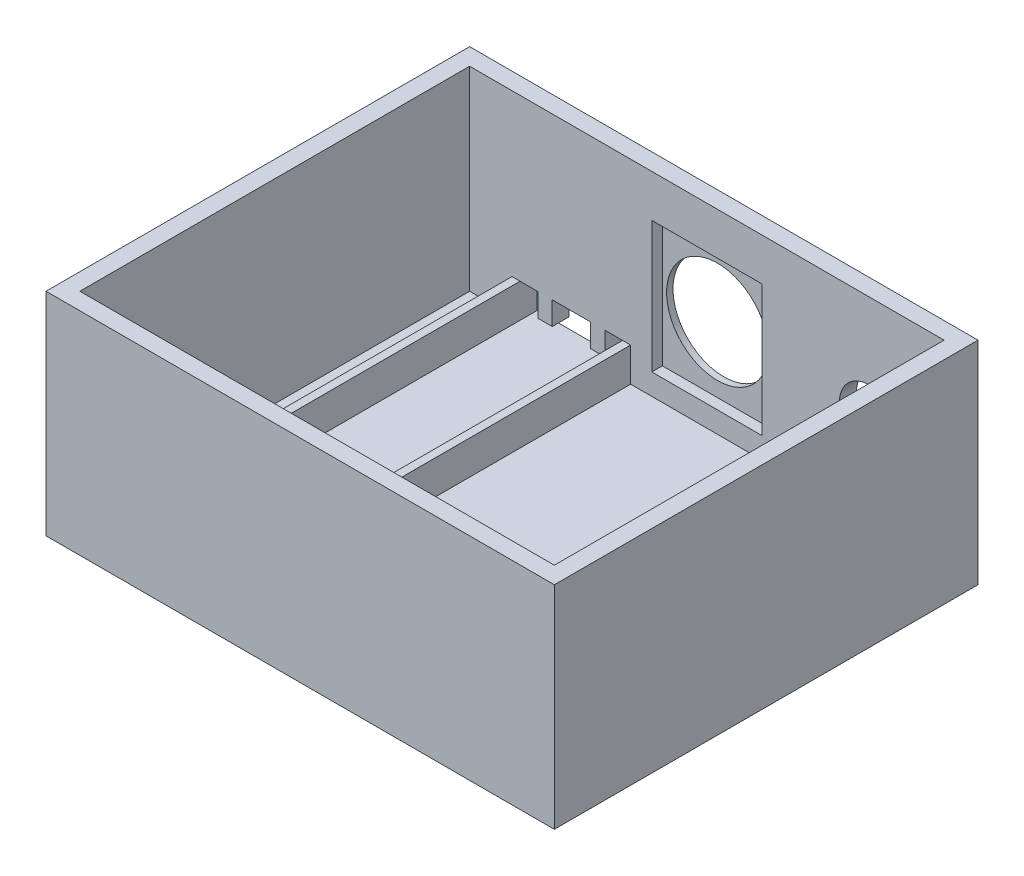
ISO-10303-21;
HEADER;
FILE_DESCRIPTION(('STEP AP214'),'2;1');
FILE_NAME('part.step','',(''),(''),'','','');
FILE_SCHEMA(('AUTOMOTIVE_DESIGN { 1 0 10303 214 1 1 1 1 }'));
ENDSEC;
DATA;
#1=APPLICATION_CONTEXT('core data for automotive mechanical design processes');
#2=APPLICATION_PROTOCOL_DEFINITION('international standard','automotive_design',2000,#1);
#3=PRODUCT_CONTEXT('',#1,'mechanical');
#4=PRODUCT('Part','Part','',(#3));
#5=PRODUCT_RELATED_PRODUCT_CATEGORY('part','',(#4));
#6=PRODUCT_DEFINITION_FORMATION('','',#4);
#7=PRODUCT_DEFINITION_CONTEXT('part definition',#1,'design');
#8=PRODUCT_DEFINITION('design','',#6,#7);
#9=PRODUCT_DEFINITION_SHAPE('','',#8);
#10=(LENGTH_UNIT() NAMED_UNIT(*) SI_UNIT(.MILLI.,.METRE.));
#11=(NAMED_UNIT(*) PLANE_ANGLE_UNIT() SI_UNIT($,.RADIAN.));
#12=(NAMED_UNIT(*) SI_UNIT($,.STERADIAN.) SOLID_ANGLE_UNIT());
#13=UNCERTAINTY_MEASURE_WITH_UNIT(LENGTH_MEASURE(1.E-05),#10,'distance_accuracy_value','');
#14=(GEOMETRIC_REPRESENTATION_CONTEXT(3) GLOBAL_UNCERTAINTY_ASSIGNED_CONTEXT((#13)) GLOBAL_UNIT_ASSIGNED_CONTEXT((#10,
#11,#12)) REPRESENTATION_CONTEXT('',''));
#15=CARTESIAN_POINT('',(0.,0.,0.));
#16=DIRECTION('',(0.,0.,1.));
#17=DIRECTION('',(1.,0.,0.));
#18=AXIS2_PLACEMENT_3D('',#15,#16,#17);
#19=CARTESIAN_POINT('',(0.,12.,0.));
#20=DIRECTION('',(0.,1.,0.));
#21=DIRECTION('',(0.,0.,1.));
#22=AXIS2_PLACEMENT_3D('',#19,#20,#21);
#23=PLANE('',#22);
#24=DIRECTION('',(0.,0.,1.));
#25=VECTOR('',#24,1.);
#26=CARTESIAN_POINT('',(-54.6743041305773,12.,-56.0826927806848));
#27=LINE('',#26,#25);
#28=CARTESIAN_POINT('',(-54.6743041305773,12.,-56.0826927806848));
#29=VERTEX_POINT('',#28);
#30=CARTESIAN_POINT('',(-54.6743041305773,12.,9.91730721931521));
#31=VERTEX_POINT('',#30);
#32=EDGE_CURVE('E318',#29,#31,#27,.T.);
#33=ORIENTED_EDGE('',*,*,#32,.F.);
#34=DIRECTION('',(1.,0.,0.));
#35=VECTOR('',#34,1.);
#36=CARTESIAN_POINT('',(-66.5712229422652,12.,-56.0826927806848));
#37=LINE('',#36,#35);
#38=CARTESIAN_POINT('',(-56.5712229422651,12.,-56.0826927806848));
#39=VERTEX_POINT('',#38);
#40=EDGE_CURVE('E419',#39,#29,#37,.T.);
#41=ORIENTED_EDGE('',*,*,#40,.F.);
#42=DIRECTION('',(0.,0.,1.));
#43=VECTOR('',#42,1.);
#44=CARTESIAN_POINT('',(-56.5712229422651,12.,-60.0826927806848));
#45=LINE('',#44,#43);
#46=CARTESIAN_POINT('',(-56.5712229422652,12.,9.91730721931521));
#47=VERTEX_POINT('',#46);
#48=EDGE_CURVE('E327',#39,#47,#45,.T.);
#49=ORIENTED_EDGE('',*,*,#48,.T.);
#50=DIRECTION('',(1.,0.,0.));
#51=VECTOR('',#50,1.);
#52=CARTESIAN_POINT('',(-56.5712229422652,12.,9.91730721931521));
#53=LINE('',#52,#51);
#54=EDGE_CURVE('E331',#47,#31,#53,.T.);
#55=ORIENTED_EDGE('',*,*,#54,.T.);
#56=EDGE_LOOP('',(#33,#41,#49,#55));
#57=FACE_BOUND('',#56,.T.);
#58=ADVANCED_FACE('F35',(#57),#23,.T.);
#59=CARTESIAN_POINT('',(-56.5712229422652,12.,9.91730721931521));
#60=DIRECTION('',(0.,0.,-1.));
#61=DIRECTION('',(-1.,0.,0.));
#62=AXIS2_PLACEMENT_3D('',#59,#60,#61);
#63=PLANE('',#62);
#64=DIRECTION('',(1.,0.,0.));
#65=VECTOR('',#64,1.);
#66=CARTESIAN_POINT('',(-56.5712229422652,4.,9.91730721931521));
#67=LINE('',#66,#65);
#68=CARTESIAN_POINT('',(-56.5712229422652,4.,9.91730721931521));
#69=VERTEX_POINT('',#68);
#70=CARTESIAN_POINT('',(-54.6743041305773,4.,9.91730721931521));
#71=VERTEX_POINT('',#70);
#72=EDGE_CURVE('E338',#69,#71,#67,.T.);
#73=ORIENTED_EDGE('',*,*,#72,.T.);
#74=DIRECTION('',(0.,-1.,0.));
#75=VECTOR('',#74,1.);
#76=CARTESIAN_POINT('',(-54.6743041305773,12.,9.91730721931521));
#77=LINE('',#76,#75);
#78=EDGE_CURVE('E297',#31,#71,#77,.T.);
#79=ORIENTED_EDGE('',*,*,#78,.F.);
#80=ORIENTED_EDGE('',*,*,#54,.F.);
#81=DIRECTION('',(0.,-1.,0.));
#82=VECTOR('',#81,1.);
#83=CARTESIAN_POINT('',(-56.5712229422652,12.,9.91730721931521));
#84=LINE('',#83,#82);
#85=EDGE_CURVE('E344',#47,#69,#84,.T.);
#86=ORIENTED_EDGE('',*,*,#85,.T.);
#87=EDGE_LOOP('',(#73,#79,#80,#86));
#88=FACE_BOUND('',#87,.T.);
#89=ADVANCED_FACE('F479',(#88),#63,.F.);
#90=CARTESIAN_POINT('',(-66.5712229422652,4.,-56.0826927806848));
#91=DIRECTION('',(0.,0.,-1.));
#92=DIRECTION('',(-1.,0.,0.));
#93=AXIS2_PLACEMENT_3D('',#90,#91,#92);
#94=PLANE('',#93);
#95=CARTESIAN_POINT('',(27.7287770577348,25.,-56.0826927806848));
#96=DIRECTION('',(0.,0.,-1.));
#97=DIRECTION('',(-1.,0.,0.));
#98=AXIS2_PLACEMENT_3D('',#95,#96,#97);
#99=CIRCLE('',#98,7.);
#100=CARTESIAN_POINT('',(20.7287770577348,25.,-56.0826927806848));
#101=VERTEX_POINT('',#100);
#102=EDGE_CURVE('E789',#101,#101,#99,.T.);
#103=ORIENTED_EDGE('',*,*,#102,.T.);
#104=EDGE_LOOP('',(#103));
#105=FACE_BOUND('',#104,.T.);
#106=DIRECTION('',(-1.,0.,0.));
#107=VECTOR('',#106,1.);
#108=CARTESIAN_POINT('',(2.42877705773484,40.,-56.0826927806848));
#109=LINE('',#108,#107);
#110=CARTESIAN_POINT('',(2.42877705773484,40.,-56.0826927806848));
#111=VERTEX_POINT('',#110);
#112=CARTESIAN_POINT('',(-23.5712229422652,40.,-56.0826927806848));
#113=VERTEX_POINT('',#112);
#114=EDGE_CURVE('E258',#111,#113,#109,.T.);
#115=ORIENTED_EDGE('',*,*,#114,.F.);
#116=DIRECTION('',(0.,1.,0.));
#117=VECTOR('',#116,1.);
#118=CARTESIAN_POINT('',(2.42877705773484,40.,-56.0826927806848));
#119=LINE('',#118,#117);
#120=CARTESIAN_POINT('',(2.42877705773484,9.00000000000001,-56.0826927806848));
#121=VERTEX_POINT('',#120);
#122=EDGE_CURVE('E50',#121,#111,#119,.T.);
#123=ORIENTED_EDGE('',*,*,#122,.F.);
#124=DIRECTION('',(1.,0.,0.));
#125=VECTOR('',#124,1.);
#126=CARTESIAN_POINT('',(2.42877705773484,9.00000000000001,-56.0826927806848));
#127=LINE('',#126,#125);
#128=CARTESIAN_POINT('',(-23.5712229422652,9.,-56.0826927806848));
#129=VERTEX_POINT('',#128);
#130=EDGE_CURVE('E246',#129,#121,#127,.T.);
#131=ORIENTED_EDGE('',*,*,#130,.F.);
#132=DIRECTION('',(0.,-1.,0.));
#133=VECTOR('',#132,1.);
#134=CARTESIAN_POINT('',(-23.5712229422652,40.,-56.0826927806848));
#135=LINE('',#134,#133);
#136=EDGE_CURVE('E249',#113,#129,#135,.T.);
#137=ORIENTED_EDGE('',*,*,#136,.F.);
#138=EDGE_LOOP('',(#115,#123,#131,#137));
#139=FACE_BOUND('',#138,.T.);
#140=ORIENTED_EDGE('',*,*,#40,.T.);
#141=DIRECTION('',(-1.,0.,0.));
#142=VECTOR('',#141,1.);
#143=CARTESIAN_POINT('',(-54.6743041305773,12.,-56.0826927806848));
#144=LINE('',#143,#142);
#145=CARTESIAN_POINT('',(-50.4743041305773,12.,-56.0826927806848));
#146=VERTEX_POINT('',#145);
#147=EDGE_CURVE('E291',#146,#29,#144,.T.);
#148=ORIENTED_EDGE('',*,*,#147,.F.);
#149=DIRECTION('',(0.,1.,0.));
#150=VECTOR('',#149,1.);
#151=CARTESIAN_POINT('',(-50.4743041305773,12.,-56.0826927806848));
#152=LINE('',#151,#150);
#153=CARTESIAN_POINT('',(-50.4743041305773,6.53,-56.0826927806848));
#154=VERTEX_POINT('',#153);
#155=EDGE_CURVE('E288',#154,#146,#152,.T.);
#156=ORIENTED_EDGE('',*,*,#155,.F.);
#157=DIRECTION('',(-1.,0.,0.));
#158=VECTOR('',#157,1.);
#159=CARTESIAN_POINT('',(-50.4743041305773,6.53,-56.0826927806848));
#160=LINE('',#159,#158);
#161=CARTESIAN_POINT('',(-47.0743041305773,6.53,-56.0826927806848));
#162=VERTEX_POINT('',#161);
#163=EDGE_CURVE('E285',#162,#154,#160,.T.);
#164=ORIENTED_EDGE('',*,*,#163,.F.);
#165=DIRECTION('',(0.,-1.,0.));
#166=VECTOR('',#165,1.);
#167=CARTESIAN_POINT('',(-47.0743041305773,6.53,-56.0826927806848));
#168=LINE('',#167,#166);
#169=CARTESIAN_POINT('',(-47.0743041305773,12.,-56.0826927806848));
#170=VERTEX_POINT('',#169);
#171=EDGE_CURVE('E282',#170,#162,#168,.T.);
#172=ORIENTED_EDGE('',*,*,#171,.F.);
#173=DIRECTION('',(-1.,0.,0.));
#174=VECTOR('',#173,1.);
#175=CARTESIAN_POINT('',(-47.0743041305773,12.,-56.0826927806848));
#176=LINE('',#175,#174);
#177=CARTESIAN_POINT('',(-38.0743041305773,12.,-56.0826927806848));
#178=VERTEX_POINT('',#177);
#179=EDGE_CURVE('E279',#178,#170,#176,.T.);
#180=ORIENTED_EDGE('',*,*,#179,.F.);
#181=DIRECTION('',(0.,1.,0.));
#182=VECTOR('',#181,1.);
#183=CARTESIAN_POINT('',(-38.0743041305773,6.53,-56.0826927806848));
#184=LINE('',#183,#182);
#185=CARTESIAN_POINT('',(-38.0743041305773,6.53,-56.0826927806848));
#186=VERTEX_POINT('',#185);
#187=EDGE_CURVE('E276',#186,#178,#184,.T.);
#188=ORIENTED_EDGE('',*,*,#187,.F.);
#189=DIRECTION('',(-1.,0.,0.));
#190=VECTOR('',#189,1.);
#191=CARTESIAN_POINT('',(-38.0743041305773,6.53,-56.0826927806848));
#192=LINE('',#191,#190);
#193=CARTESIAN_POINT('',(-34.6643041305773,6.53,-56.0826927806848));
#194=VERTEX_POINT('',#193);
#195=EDGE_CURVE('E273',#194,#186,#192,.T.);
#196=ORIENTED_EDGE('',*,*,#195,.F.);
#197=DIRECTION('',(0.,-1.,0.));
#198=VECTOR('',#197,1.);
#199=CARTESIAN_POINT('',(-34.6643041305773,12.,-56.0826927806848));
#200=LINE('',#199,#198);
#201=CARTESIAN_POINT('',(-34.6643041305773,12.,-56.0826927806848));
#202=VERTEX_POINT('',#201);
#203=EDGE_CURVE('E270',#202,#194,#200,.T.);
#204=ORIENTED_EDGE('',*,*,#203,.F.);
#205=DIRECTION('',(-1.,0.,0.));
#206=VECTOR('',#205,1.);
#207=CARTESIAN_POINT('',(-34.6643041305773,12.,-56.0826927806848));
#208=LINE('',#207,#206);
#209=CARTESIAN_POINT('',(-30.4643041305773,12.,-56.0826927806848));
#210=VERTEX_POINT('',#209);
#211=EDGE_CURVE('E264',#210,#202,#208,.T.);
#212=ORIENTED_EDGE('',*,*,#211,.F.);
#213=CARTESIAN_POINT('',(-28.5712229422651,12.,-56.0826927806848));
#214=VERTEX_POINT('',#213);
#215=EDGE_CURVE('E418',#210,#214,#37,.T.);
#216=ORIENTED_EDGE('',*,*,#215,.T.);
#217=DIRECTION('',(0.,1.,0.));
#218=VECTOR('',#217,1.);
#219=CARTESIAN_POINT('',(-28.5712229422651,4.,-56.0826927806848));
#220=LINE('',#219,#218);
#221=CARTESIAN_POINT('',(-28.5712229422651,4.,-56.0826927806848));
#222=VERTEX_POINT('',#221);
#223=EDGE_CURVE('E347',#222,#214,#220,.T.);
#224=ORIENTED_EDGE('',*,*,#223,.F.);
#225=DIRECTION('',(-1.,0.,0.));
#226=VECTOR('',#225,1.);
#227=CARTESIAN_POINT('',(-66.5712229422652,4.,-56.0826927806848));
#228=LINE('',#227,#226);
#229=CARTESIAN_POINT('',(45.4287770577348,4.,-56.0826927806848));
#230=VERTEX_POINT('',#229);
#231=EDGE_CURVE('E364',#230,#222,#228,.T.);
#232=ORIENTED_EDGE('',*,*,#231,.F.);
#233=DIRECTION('',(0.,1.,0.));
#234=VECTOR('',#233,1.);
#235=CARTESIAN_POINT('',(45.4287770577348,4.,-56.0826927806848));
#236=LINE('',#235,#234);
#237=CARTESIAN_POINT('',(45.4287770577348,50.,-56.0826927806848));
#238=VERTEX_POINT('',#237);
#239=EDGE_CURVE('E380',#230,#238,#236,.T.);
#240=ORIENTED_EDGE('',*,*,#239,.T.);
#241=DIRECTION('',(-1.,0.,0.));
#242=VECTOR('',#241,1.);
#243=CARTESIAN_POINT('',(-66.5712229422652,50.,-56.0826927806848));
#244=LINE('',#243,#242);
#245=CARTESIAN_POINT('',(-66.5712229422652,50.,-56.0826927806848));
#246=VERTEX_POINT('',#245);
#247=EDGE_CURVE('E357',#238,#246,#244,.T.);
#248=ORIENTED_EDGE('',*,*,#247,.T.);
#249=DIRECTION('',(0.,1.,0.));
#250=VECTOR('',#249,1.);
#251=CARTESIAN_POINT('',(-66.5712229422652,4.,-56.0826927806848));
#252=LINE('',#251,#250);
#253=CARTESIAN_POINT('',(-66.5712229422652,4.,-56.0826927806848));
#254=VERTEX_POINT('',#253);
#255=EDGE_CURVE('E377',#254,#246,#252,.T.);
#256=ORIENTED_EDGE('',*,*,#255,.F.);
#257=CARTESIAN_POINT('',(-56.5712229422651,4.,-56.0826927806848));
#258=VERTEX_POINT('',#257);
#259=EDGE_CURVE('E363',#258,#254,#228,.T.);
#260=ORIENTED_EDGE('',*,*,#259,.F.);
#261=DIRECTION('',(0.,-1.,0.));
#262=VECTOR('',#261,1.);
#263=CARTESIAN_POINT('',(-56.5712229422651,4.,-56.0826927806848));
#264=LINE('',#263,#262);
#265=EDGE_CURVE('E350',#39,#258,#264,.T.);
#266=ORIENTED_EDGE('',*,*,#265,.F.);
#267=EDGE_LOOP('',(#140,#148,#156,#164,#172,#180,#188,#196,#204,#212,#216,#224,#232,#240,#248,
#256,#260,#266));
#268=FACE_BOUND('',#267,.T.);
#269=ADVANCED_FACE('F467',(#105,#139,#268),#94,.F.);
#270=CARTESIAN_POINT('',(0.,4.,0.));
#271=DIRECTION('',(0.,1.,0.));
#272=DIRECTION('',(0.,0.,1.));
#273=AXIS2_PLACEMENT_3D('',#270,#271,#272);
#274=PLANE('',#273);
#275=ORIENTED_EDGE('',*,*,#72,.F.);
#276=DIRECTION('',(0.,0.,-1.));
#277=VECTOR('',#276,1.);
#278=CARTESIAN_POINT('',(-56.5712229422652,4.,0.));
#279=LINE('',#278,#277);
#280=EDGE_CURVE('E415',#69,#258,#279,.T.);
#281=ORIENTED_EDGE('',*,*,#280,.T.);
#282=ORIENTED_EDGE('',*,*,#259,.T.);
#283=DIRECTION('',(0.,0.,1.));
#284=VECTOR('',#283,1.);
#285=CARTESIAN_POINT('',(-66.5712229422652,4.,-56.0826927806848));
#286=LINE('',#285,#284);
#287=CARTESIAN_POINT('',(-66.5712229422651,4.,35.9173072193152));
#288=VERTEX_POINT('',#287);
#289=EDGE_CURVE('E353',#254,#288,#286,.T.);
#290=ORIENTED_EDGE('',*,*,#289,.T.);
#291=DIRECTION('',(1.,0.,0.));
#292=VECTOR('',#291,1.);
#293=CARTESIAN_POINT('',(-66.5712229422651,4.,35.9173072193152));
#294=LINE('',#293,#292);
#295=CARTESIAN_POINT('',(45.4287770577348,4.,35.9173072193152));
#296=VERTEX_POINT('',#295);
#297=EDGE_CURVE('E356',#288,#296,#294,.T.);
#298=ORIENTED_EDGE('',*,*,#297,.T.);
#299=DIRECTION('',(0.,0.,-1.));
#300=VECTOR('',#299,1.);
#301=CARTESIAN_POINT('',(45.4287770577348,4.,-56.0826927806848));
#302=LINE('',#301,#300);
#303=EDGE_CURVE('E360',#296,#230,#302,.T.);
#304=ORIENTED_EDGE('',*,*,#303,.T.);
#305=ORIENTED_EDGE('',*,*,#231,.T.);
#306=DIRECTION('',(0.,0.,-1.));
#307=VECTOR('',#306,1.);
#308=CARTESIAN_POINT('',(-28.5712229422651,4.,-60.0826927806848));
#309=LINE('',#308,#307);
#310=CARTESIAN_POINT('',(-28.5712229422651,4.,9.91730721931521));
#311=VERTEX_POINT('',#310);
#312=EDGE_CURVE('E330',#311,#222,#309,.T.);
#313=ORIENTED_EDGE('',*,*,#312,.F.);
#314=CARTESIAN_POINT('',(-30.4643041305773,4.,9.91730721931521));
#315=VERTEX_POINT('',#314);
#316=EDGE_CURVE('E320',#315,#311,#67,.T.);
#317=ORIENTED_EDGE('',*,*,#316,.F.);
#318=DIRECTION('',(0.,0.,1.));
#319=VECTOR('',#318,1.);
#320=CARTESIAN_POINT('',(-30.4643041305773,4.,-56.0826927806848));
#321=LINE('',#320,#319);
#322=CARTESIAN_POINT('',(-30.4643041305773,4.,-60.0826927806848));
#323=VERTEX_POINT('',#322);
#324=EDGE_CURVE('E324',#323,#315,#321,.T.);
#325=ORIENTED_EDGE('',*,*,#324,.F.);
#326=DIRECTION('',(1.,0.,0.));
#327=VECTOR('',#326,1.);
#328=CARTESIAN_POINT('',(-70.5712229422652,4.,-60.0826927806848));
#329=LINE('',#328,#327);
#330=CARTESIAN_POINT('',(-54.6743041305773,4.,-60.0826927806848));
#331=VERTEX_POINT('',#330);
#332=EDGE_CURVE('E425',#331,#323,#329,.T.);
#333=ORIENTED_EDGE('',*,*,#332,.F.);
#334=DIRECTION('',(0.,0.,1.));
#335=VECTOR('',#334,1.);
#336=CARTESIAN_POINT('',(-54.6743041305773,4.,-56.0826927806848));
#337=LINE('',#336,#335);
#338=EDGE_CURVE('E58',#331,#71,#337,.T.);
#339=ORIENTED_EDGE('',*,*,#338,.T.);
#340=EDGE_LOOP('',(#275,#281,#282,#290,#298,#304,#305,#313,#317,#325,#333,#339));
#341=FACE_BOUND('',#340,.T.);
#342=ADVANCED_FACE('F483',(#341),#274,.T.);
#343=CARTESIAN_POINT('',(-70.5712229422652,50.,39.9173072193152));
#344=DIRECTION('',(1.,0.,0.));
#345=DIRECTION('',(0.,0.,-1.));
#346=AXIS2_PLACEMENT_3D('',#343,#344,#345);
#347=PLANE('',#346);
#348=DIRECTION('',(0.,0.,1.));
#349=VECTOR('',#348,1.);
#350=CARTESIAN_POINT('',(-70.5712229422652,0.,39.9173072193152));
#351=LINE('',#350,#349);
#352=CARTESIAN_POINT('',(-70.5712229422652,0.,-60.0826927806848));
#353=VERTEX_POINT('',#352);
#354=CARTESIAN_POINT('',(-70.5712229422652,0.,39.9173072193152));
#355=VERTEX_POINT('',#354);
#356=EDGE_CURVE('E379',#353,#355,#351,.T.);
#357=ORIENTED_EDGE('',*,*,#356,.T.);
#358=DIRECTION('',(0.,-1.,0.));
#359=VECTOR('',#358,1.);
#360=CARTESIAN_POINT('',(-70.5712229422652,50.,39.9173072193152));
#361=LINE('',#360,#359);
#362=CARTESIAN_POINT('',(-70.5712229422652,50.,39.9173072193152));
#363=VERTEX_POINT('',#362);
#364=EDGE_CURVE('E412',#363,#355,#361,.T.);
#365=ORIENTED_EDGE('',*,*,#364,.F.);
#366=DIRECTION('',(0.,0.,1.));
#367=VECTOR('',#366,1.);
#368=CARTESIAN_POINT('',(-70.5712229422652,50.,39.9173072193152));
#369=LINE('',#368,#367);
#370=CARTESIAN_POINT('',(-70.5712229422652,50.,-60.0826927806848));
#371=VERTEX_POINT('',#370);
#372=EDGE_CURVE('E386',#371,#363,#369,.T.);
#373=ORIENTED_EDGE('',*,*,#372,.F.);
#374=DIRECTION('',(0.,-1.,0.));
#375=VECTOR('',#374,1.);
#376=CARTESIAN_POINT('',(-70.5712229422652,50.,-60.0826927806848));
#377=LINE('',#376,#375);
#378=EDGE_CURVE('E396',#371,#353,#377,.T.);
#379=ORIENTED_EDGE('',*,*,#378,.T.);
#380=EDGE_LOOP('',(#357,#365,#373,#379));
#381=FACE_BOUND('',#380,.T.);
#382=ADVANCED_FACE('F37',(#381),#347,.F.);
#383=CARTESIAN_POINT('',(-70.5712229422652,50.,39.9173072193152));
#384=DIRECTION('',(0.,0.,-1.));
#385=DIRECTION('',(-1.,0.,0.));
#386=AXIS2_PLACEMENT_3D('',#383,#384,#385);
#387=PLANE('',#386);
#388=DIRECTION('',(1.,0.,0.));
#389=VECTOR('',#388,1.);
#390=CARTESIAN_POINT('',(-70.5712229422652,0.,39.9173072193152));
#391=LINE('',#390,#389);
#392=CARTESIAN_POINT('',(49.4287770577348,0.,39.9173072193152));
#393=VERTEX_POINT('',#392);
#394=EDGE_CURVE('E399',#355,#393,#391,.T.);
#395=ORIENTED_EDGE('',*,*,#394,.T.);
#396=DIRECTION('',(0.,-1.,0.));
#397=VECTOR('',#396,1.);
#398=CARTESIAN_POINT('',(49.4287770577348,50.,39.9173072193152));
#399=LINE('',#398,#397);
#400=CARTESIAN_POINT('',(49.4287770577348,50.,39.9173072193152));
#401=VERTEX_POINT('',#400);
#402=EDGE_CURVE('E409',#401,#393,#399,.T.);
#403=ORIENTED_EDGE('',*,*,#402,.F.);
#404=DIRECTION('',(1.,0.,0.));
#405=VECTOR('',#404,1.);
#406=CARTESIAN_POINT('',(-70.5712229422652,50.,39.9173072193152));
#407=LINE('',#406,#405);
#408=EDGE_CURVE('E389',#363,#401,#407,.T.);
#409=ORIENTED_EDGE('',*,*,#408,.F.);
#410=ORIENTED_EDGE('',*,*,#364,.T.);
#411=EDGE_LOOP('',(#395,#403,#409,#410));
#412=FACE_BOUND('',#411,.T.);
#413=ADVANCED_FACE('F587',(#412),#387,.F.);
#414=CARTESIAN_POINT('',(49.4287770577348,50.,39.9173072193152));
#415=DIRECTION('',(-1.,0.,0.));
#416=DIRECTION('',(0.,0.,1.));
#417=AXIS2_PLACEMENT_3D('',#414,#415,#416);
#418=PLANE('',#417);
#419=DIRECTION('',(0.,0.,-1.));
#420=VECTOR('',#419,1.);
#421=CARTESIAN_POINT('',(49.4287770577348,0.,39.9173072193152));
#422=LINE('',#421,#420);
#423=CARTESIAN_POINT('',(49.4287770577348,0.,-60.0826927806848));
#424=VERTEX_POINT('',#423);
#425=EDGE_CURVE('E401',#393,#424,#422,.T.);
#426=ORIENTED_EDGE('',*,*,#425,.T.);
#427=DIRECTION('',(0.,-1.,0.));
#428=VECTOR('',#427,1.);
#429=CARTESIAN_POINT('',(49.4287770577348,50.,-60.0826927806848));
#430=LINE('',#429,#428);
#431=CARTESIAN_POINT('',(49.4287770577348,50.,-60.0826927806848));
#432=VERTEX_POINT('',#431);
#433=EDGE_CURVE('E406',#432,#424,#430,.T.);
#434=ORIENTED_EDGE('',*,*,#433,.F.);
#435=DIRECTION('',(0.,0.,-1.));
#436=VECTOR('',#435,1.);
#437=CARTESIAN_POINT('',(49.4287770577348,50.,39.9173072193152));
#438=LINE('',#437,#436);
#439=EDGE_CURVE('E392',#401,#432,#438,.T.);
#440=ORIENTED_EDGE('',*,*,#439,.F.);
#441=ORIENTED_EDGE('',*,*,#402,.T.);
#442=EDGE_LOOP('',(#426,#434,#440,#441));
#443=FACE_BOUND('',#442,.T.);
#444=ADVANCED_FACE('F584',(#443),#418,.F.);
#445=CARTESIAN_POINT('',(-70.5712229422652,50.,-60.0826927806848));
#446=DIRECTION('',(0.,0.,1.));
#447=DIRECTION('',(1.,0.,0.));
#448=AXIS2_PLACEMENT_3D('',#445,#446,#447);
#449=PLANE('',#448);
#450=CARTESIAN_POINT('',(27.7287770577348,25.,-60.0826927806848));
#451=DIRECTION('',(0.,0.,-1.));
#452=DIRECTION('',(-1.,0.,0.));
#453=AXIS2_PLACEMENT_3D('',#450,#451,#452);
#454=CIRCLE('',#453,7.);
#455=CARTESIAN_POINT('',(20.7287770577348,25.,-60.0826927806848));
#456=VERTEX_POINT('',#455);
#457=EDGE_CURVE('E786',#456,#456,#454,.T.);
#458=ORIENTED_EDGE('',*,*,#457,.F.);
#459=EDGE_LOOP('',(#458));
#460=FACE_BOUND('',#459,.T.);
#461=CARTESIAN_POINT('',(-10.5712229422652,24.5,-60.0826927806848));
#462=DIRECTION('',(0.,0.,1.));
#463=DIRECTION('',(1.,0.,0.));
#464=AXIS2_PLACEMENT_3D('',#461,#462,#463);
#465=CIRCLE('',#464,12.);
#466=CARTESIAN_POINT('',(1.42877705773484,24.5,-60.0826927806848));
#467=VERTEX_POINT('',#466);
#468=EDGE_CURVE('E252',#467,#467,#465,.T.);
#469=ORIENTED_EDGE('',*,*,#468,.T.);
#470=EDGE_LOOP('',(#469));
#471=FACE_BOUND('',#470,.T.);
#472=DIRECTION('',(0.,1.,0.));
#473=VECTOR('',#472,1.);
#474=CARTESIAN_POINT('',(-50.4743041305773,50.,-60.0826927806848));
#475=LINE('',#474,#473);
#476=CARTESIAN_POINT('',(-50.4743041305773,6.53,-60.0826927806848));
#477=VERTEX_POINT('',#476);
#478=CARTESIAN_POINT('',(-50.4743041305773,12.,-60.0826927806848));
#479=VERTEX_POINT('',#478);
#480=EDGE_CURVE('E43',#477,#479,#475,.T.);
#481=ORIENTED_EDGE('',*,*,#480,.T.);
#482=DIRECTION('',(-1.,0.,0.));
#483=VECTOR('',#482,1.);
#484=CARTESIAN_POINT('',(-70.5712229422652,12.,-60.0826927806848));
#485=LINE('',#484,#483);
#486=CARTESIAN_POINT('',(-54.6743041305773,12.,-60.0826927806848));
#487=VERTEX_POINT('',#486);
#488=EDGE_CURVE('E11',#479,#487,#485,.T.);
#489=ORIENTED_EDGE('',*,*,#488,.T.);
#490=DIRECTION('',(0.,-1.,0.));
#491=VECTOR('',#490,1.);
#492=CARTESIAN_POINT('',(-54.6743041305774,50.,-60.0826927806848));
#493=LINE('',#492,#491);
#494=EDGE_CURVE('E422',#487,#331,#493,.T.);
#495=ORIENTED_EDGE('',*,*,#494,.T.);
#496=ORIENTED_EDGE('',*,*,#332,.T.);
#497=DIRECTION('',(0.,1.,0.));
#498=VECTOR('',#497,1.);
#499=CARTESIAN_POINT('',(-30.4643041305774,50.,-60.0826927806848));
#500=LINE('',#499,#498);
#501=CARTESIAN_POINT('',(-30.4643041305773,12.,-60.0826927806848));
#502=VERTEX_POINT('',#501);
#503=EDGE_CURVE('E428',#323,#502,#500,.T.);
#504=ORIENTED_EDGE('',*,*,#503,.T.);
#505=DIRECTION('',(-1.,0.,0.));
#506=VECTOR('',#505,1.);
#507=CARTESIAN_POINT('',(-70.5712229422652,12.,-60.0826927806848));
#508=LINE('',#507,#506);
#509=CARTESIAN_POINT('',(-34.6643041305773,12.,-60.0826927806848));
#510=VERTEX_POINT('',#509);
#511=EDGE_CURVE('E431',#502,#510,#508,.T.);
#512=ORIENTED_EDGE('',*,*,#511,.T.);
#513=DIRECTION('',(0.,-1.,0.));
#514=VECTOR('',#513,1.);
#515=CARTESIAN_POINT('',(-34.6643041305774,50.,-60.0826927806848));
#516=LINE('',#515,#514);
#517=CARTESIAN_POINT('',(-34.6643041305773,6.53,-60.0826927806848));
#518=VERTEX_POINT('',#517);
#519=EDGE_CURVE('E434',#510,#518,#516,.T.);
#520=ORIENTED_EDGE('',*,*,#519,.T.);
#521=DIRECTION('',(-1.,0.,0.));
#522=VECTOR('',#521,1.);
#523=CARTESIAN_POINT('',(-70.5712229422652,6.53,-60.0826927806848));
#524=LINE('',#523,#522);
#525=CARTESIAN_POINT('',(-38.0743041305773,6.53,-60.0826927806848));
#526=VERTEX_POINT('',#525);
#527=EDGE_CURVE('E437',#518,#526,#524,.T.);
#528=ORIENTED_EDGE('',*,*,#527,.T.);
#529=DIRECTION('',(0.,1.,0.));
#530=VECTOR('',#529,1.);
#531=CARTESIAN_POINT('',(-38.0743041305772,50.,-60.0826927806848));
#532=LINE('',#531,#530);
#533=CARTESIAN_POINT('',(-38.0743041305773,12.,-60.0826927806848));
#534=VERTEX_POINT('',#533);
#535=EDGE_CURVE('E440',#526,#534,#532,.T.);
#536=ORIENTED_EDGE('',*,*,#535,.T.);
#537=DIRECTION('',(-1.,0.,0.));
#538=VECTOR('',#537,1.);
#539=CARTESIAN_POINT('',(-70.5712229422652,12.,-60.0826927806848));
#540=LINE('',#539,#538);
#541=CARTESIAN_POINT('',(-47.0743041305773,12.,-60.0826927806848));
#542=VERTEX_POINT('',#541);
#543=EDGE_CURVE('E443',#534,#542,#540,.T.);
#544=ORIENTED_EDGE('',*,*,#543,.T.);
#545=DIRECTION('',(0.,-1.,0.));
#546=VECTOR('',#545,1.);
#547=CARTESIAN_POINT('',(-47.0743041305772,50.,-60.0826927806848));
#548=LINE('',#547,#546);
#549=CARTESIAN_POINT('',(-47.0743041305773,6.53,-60.0826927806848));
#550=VERTEX_POINT('',#549);
#551=EDGE_CURVE('E446',#542,#550,#548,.T.);
#552=ORIENTED_EDGE('',*,*,#551,.T.);
#553=DIRECTION('',(-1.,0.,0.));
#554=VECTOR('',#553,1.);
#555=CARTESIAN_POINT('',(-70.5712229422652,6.53,-60.0826927806848));
#556=LINE('',#555,#554);
#557=EDGE_CURVE('E449',#550,#477,#556,.T.);
#558=ORIENTED_EDGE('',*,*,#557,.T.);
#559=EDGE_LOOP('',(#481,#489,#495,#496,#504,#512,#520,#528,#536,#544,#552,#558));
#560=FACE_BOUND('',#559,.T.);
#561=DIRECTION('',(-1.,0.,0.));
#562=VECTOR('',#561,1.);
#563=CARTESIAN_POINT('',(-70.5712229422652,0.,-60.0826927806848));
#564=LINE('',#563,#562);
#565=EDGE_CURVE('E390',#424,#353,#564,.T.);
#566=ORIENTED_EDGE('',*,*,#565,.T.);
#567=ORIENTED_EDGE('',*,*,#378,.F.);
#568=DIRECTION('',(-1.,0.,0.));
#569=VECTOR('',#568,1.);
#570=CARTESIAN_POINT('',(-70.5712229422652,50.,-60.0826927806848));
#571=LINE('',#570,#569);
#572=EDGE_CURVE('E394',#432,#371,#571,.T.);
#573=ORIENTED_EDGE('',*,*,#572,.F.);
#574=ORIENTED_EDGE('',*,*,#433,.T.);
#575=EDGE_LOOP('',(#566,#567,#573,#574));
#576=FACE_BOUND('',#575,.T.);
#577=ADVANCED_FACE('F453',(#460,#471,#560,#576),#449,.F.);
#578=CARTESIAN_POINT('',(0.,50.,0.));
#579=DIRECTION('',(0.,-1.,0.));
#580=DIRECTION('',(0.,0.,-1.));
#581=AXIS2_PLACEMENT_3D('',#578,#579,#580);
#582=PLANE('',#581);
#583=DIRECTION('',(1.,0.,0.));
#584=VECTOR('',#583,1.);
#585=CARTESIAN_POINT('',(-66.5712229422651,50.,35.9173072193152));
#586=LINE('',#585,#584);
#587=CARTESIAN_POINT('',(-66.5712229422651,50.,35.9173072193152));
#588=VERTEX_POINT('',#587);
#589=CARTESIAN_POINT('',(45.4287770577348,50.,35.9173072193152));
#590=VERTEX_POINT('',#589);
#591=EDGE_CURVE('E369',#588,#590,#586,.T.);
#592=ORIENTED_EDGE('',*,*,#591,.F.);
#593=DIRECTION('',(0.,0.,1.));
#594=VECTOR('',#593,1.);
#595=CARTESIAN_POINT('',(-66.5712229422652,50.,-56.0826927806848));
#596=LINE('',#595,#594);
#597=EDGE_CURVE('E352',#246,#588,#596,.T.);
#598=ORIENTED_EDGE('',*,*,#597,.F.);
#599=ORIENTED_EDGE('',*,*,#247,.F.);
#600=DIRECTION('',(0.,0.,-1.));
#601=VECTOR('',#600,1.);
#602=CARTESIAN_POINT('',(45.4287770577348,50.,-56.0826927806848));
#603=LINE('',#602,#601);
#604=EDGE_CURVE('E372',#590,#238,#603,.T.);
#605=ORIENTED_EDGE('',*,*,#604,.F.);
#606=EDGE_LOOP('',(#592,#598,#599,#605));
#607=FACE_BOUND('',#606,.T.);
#608=ORIENTED_EDGE('',*,*,#372,.T.);
#609=ORIENTED_EDGE('',*,*,#408,.T.);
#610=ORIENTED_EDGE('',*,*,#439,.T.);
#611=ORIENTED_EDGE('',*,*,#572,.T.);
#612=EDGE_LOOP('',(#608,#609,#610,#611));
#613=FACE_BOUND('',#612,.T.);
#614=ADVANCED_FACE('F565',(#607,#613),#582,.F.);
#615=CARTESIAN_POINT('',(0.,0.,0.));
#616=DIRECTION('',(0.,-1.,0.));
#617=DIRECTION('',(0.,0.,-1.));
#618=AXIS2_PLACEMENT_3D('',#615,#616,#617);
#619=PLANE('',#618);
#620=ORIENTED_EDGE('',*,*,#356,.F.);
#621=ORIENTED_EDGE('',*,*,#565,.F.);
#622=ORIENTED_EDGE('',*,*,#425,.F.);
#623=ORIENTED_EDGE('',*,*,#394,.F.);
#624=EDGE_LOOP('',(#620,#621,#622,#623));
#625=FACE_BOUND('',#624,.T.);
#626=ADVANCED_FACE('F570',(#625),#619,.T.);
#627=CARTESIAN_POINT('',(-66.5712229422652,4.,-56.0826927806848));
#628=DIRECTION('',(-1.,0.,0.));
#629=DIRECTION('',(0.,0.,1.));
#630=AXIS2_PLACEMENT_3D('',#627,#628,#629);
#631=PLANE('',#630);
#632=ORIENTED_EDGE('',*,*,#597,.T.);
#633=DIRECTION('',(0.,1.,0.));
#634=VECTOR('',#633,1.);
#635=CARTESIAN_POINT('',(-66.5712229422651,4.,35.9173072193152));
#636=LINE('',#635,#634);
#637=EDGE_CURVE('E367',#288,#588,#636,.T.);
#638=ORIENTED_EDGE('',*,*,#637,.F.);
#639=ORIENTED_EDGE('',*,*,#289,.F.);
#640=ORIENTED_EDGE('',*,*,#255,.T.);
#641=EDGE_LOOP('',(#632,#638,#639,#640));
#642=FACE_BOUND('',#641,.T.);
#643=ADVANCED_FACE('F568',(#642),#631,.F.);
#644=CARTESIAN_POINT('',(45.4287770577348,4.,-56.0826927806848));
#645=DIRECTION('',(1.,0.,0.));
#646=DIRECTION('',(0.,0.,-1.));
#647=AXIS2_PLACEMENT_3D('',#644,#645,#646);
#648=PLANE('',#647);
#649=ORIENTED_EDGE('',*,*,#604,.T.);
#650=ORIENTED_EDGE('',*,*,#239,.F.);
#651=ORIENTED_EDGE('',*,*,#303,.F.);
#652=DIRECTION('',(0.,1.,0.));
#653=VECTOR('',#652,1.);
#654=CARTESIAN_POINT('',(45.4287770577348,4.,35.9173072193152));
#655=LINE('',#654,#653);
#656=EDGE_CURVE('E382',#296,#590,#655,.T.);
#657=ORIENTED_EDGE('',*,*,#656,.T.);
#658=EDGE_LOOP('',(#649,#650,#651,#657));
#659=FACE_BOUND('',#658,.T.);
#660=ADVANCED_FACE('F545',(#659),#648,.F.);
#661=CARTESIAN_POINT('',(-66.5712229422651,4.,35.9173072193152));
#662=DIRECTION('',(0.,0.,1.));
#663=DIRECTION('',(1.,0.,0.));
#664=AXIS2_PLACEMENT_3D('',#661,#662,#663);
#665=PLANE('',#664);
#666=ORIENTED_EDGE('',*,*,#591,.T.);
#667=ORIENTED_EDGE('',*,*,#656,.F.);
#668=ORIENTED_EDGE('',*,*,#297,.F.);
#669=ORIENTED_EDGE('',*,*,#637,.T.);
#670=EDGE_LOOP('',(#666,#667,#668,#669));
#671=FACE_BOUND('',#670,.T.);
#672=ADVANCED_FACE('F536',(#671),#665,.F.);
#673=DIRECTION('',(0.,0.,1.));
#674=VECTOR('',#673,1.);
#675=CARTESIAN_POINT('',(-30.4643041305773,12.,-56.0826927806848));
#676=LINE('',#675,#674);
#677=CARTESIAN_POINT('',(-30.4643041305773,12.,9.91730721931521));
#678=VERTEX_POINT('',#677);
#679=EDGE_CURVE('E321',#210,#678,#676,.T.);
#680=ORIENTED_EDGE('',*,*,#679,.T.);
#681=CARTESIAN_POINT('',(-28.5712229422651,12.,9.91730721931521));
#682=VERTEX_POINT('',#681);
#683=EDGE_CURVE('E329',#678,#682,#53,.T.);
#684=ORIENTED_EDGE('',*,*,#683,.T.);
#685=DIRECTION('',(0.,0.,-1.));
#686=VECTOR('',#685,1.);
#687=CARTESIAN_POINT('',(-28.5712229422651,12.,-60.0826927806848));
#688=LINE('',#687,#686);
#689=EDGE_CURVE('E334',#682,#214,#688,.T.);
#690=ORIENTED_EDGE('',*,*,#689,.T.);
#691=ORIENTED_EDGE('',*,*,#215,.F.);
#692=EDGE_LOOP('',(#680,#684,#690,#691));
#693=FACE_BOUND('',#692,.T.);
#694=ADVANCED_FACE('F526',(#693),#23,.T.);
#695=CARTESIAN_POINT('',(-56.5712229422651,12.,-60.0826927806848));
#696=DIRECTION('',(1.,0.,0.));
#697=DIRECTION('',(0.,0.,-1.));
#698=AXIS2_PLACEMENT_3D('',#695,#696,#697);
#699=PLANE('',#698);
#700=ORIENTED_EDGE('',*,*,#48,.F.);
#701=ORIENTED_EDGE('',*,*,#265,.T.);
#702=ORIENTED_EDGE('',*,*,#280,.F.);
#703=ORIENTED_EDGE('',*,*,#85,.F.);
#704=EDGE_LOOP('',(#700,#701,#702,#703));
#705=FACE_BOUND('',#704,.T.);
#706=ADVANCED_FACE('F535',(#705),#699,.F.);
#707=CARTESIAN_POINT('',(-28.5712229422651,12.,-60.0826927806848));
#708=DIRECTION('',(-1.,0.,0.));
#709=DIRECTION('',(0.,0.,1.));
#710=AXIS2_PLACEMENT_3D('',#707,#708,#709);
#711=PLANE('',#710);
#712=ORIENTED_EDGE('',*,*,#312,.T.);
#713=ORIENTED_EDGE('',*,*,#223,.T.);
#714=ORIENTED_EDGE('',*,*,#689,.F.);
#715=DIRECTION('',(0.,-1.,0.));
#716=VECTOR('',#715,1.);
#717=CARTESIAN_POINT('',(-28.5712229422651,12.,9.91730721931521));
#718=LINE('',#717,#716);
#719=EDGE_CURVE('E337',#682,#311,#718,.T.);
#720=ORIENTED_EDGE('',*,*,#719,.T.);
#721=EDGE_LOOP('',(#712,#713,#714,#720));
#722=FACE_BOUND('',#721,.T.);
#723=ADVANCED_FACE('F542',(#722),#711,.F.);
#724=ORIENTED_EDGE('',*,*,#683,.F.);
#725=DIRECTION('',(0.,1.,0.));
#726=VECTOR('',#725,1.);
#727=CARTESIAN_POINT('',(-30.4643041305773,12.,9.91730721931521));
#728=LINE('',#727,#726);
#729=EDGE_CURVE('E316',#315,#678,#728,.T.);
#730=ORIENTED_EDGE('',*,*,#729,.F.);
#731=ORIENTED_EDGE('',*,*,#316,.T.);
#732=ORIENTED_EDGE('',*,*,#719,.F.);
#733=EDGE_LOOP('',(#724,#730,#731,#732));
#734=FACE_BOUND('',#733,.T.);
#735=ADVANCED_FACE('F531',(#734),#63,.F.);
#736=CARTESIAN_POINT('',(-54.6743041305773,12.,-56.0826927806848));
#737=DIRECTION('',(-1.,0.,0.));
#738=DIRECTION('',(0.,0.,1.));
#739=AXIS2_PLACEMENT_3D('',#736,#737,#738);
#740=PLANE('',#739);
#741=ORIENTED_EDGE('',*,*,#78,.T.);
#742=ORIENTED_EDGE('',*,*,#338,.F.);
#743=ORIENTED_EDGE('',*,*,#494,.F.);
#744=DIRECTION('',(0.,0.,1.));
#745=VECTOR('',#744,1.);
#746=CARTESIAN_POINT('',(-54.6743041305773,12.,-122.082692780685));
#747=LINE('',#746,#745);
#748=EDGE_CURVE('E295',#487,#29,#747,.T.);
#749=ORIENTED_EDGE('',*,*,#748,.T.);
#750=ORIENTED_EDGE('',*,*,#32,.T.);
#751=EDGE_LOOP('',(#741,#742,#743,#749,#750));
#752=FACE_BOUND('',#751,.T.);
#753=ADVANCED_FACE('F477',(#752),#740,.F.);
#754=CARTESIAN_POINT('',(-30.4643041305773,12.,-56.0826927806848));
#755=DIRECTION('',(1.,0.,0.));
#756=DIRECTION('',(0.,1.,0.));
#757=AXIS2_PLACEMENT_3D('',#754,#755,#756);
#758=PLANE('',#757);
#759=ORIENTED_EDGE('',*,*,#729,.T.);
#760=ORIENTED_EDGE('',*,*,#679,.F.);
#761=DIRECTION('',(0.,0.,1.));
#762=VECTOR('',#761,1.);
#763=CARTESIAN_POINT('',(-30.4643041305773,12.,-122.082692780685));
#764=LINE('',#763,#762);
#765=EDGE_CURVE('E294',#502,#210,#764,.T.);
#766=ORIENTED_EDGE('',*,*,#765,.F.);
#767=ORIENTED_EDGE('',*,*,#503,.F.);
#768=ORIENTED_EDGE('',*,*,#324,.T.);
#769=EDGE_LOOP('',(#759,#760,#766,#767,#768));
#770=FACE_BOUND('',#769,.T.);
#771=ADVANCED_FACE('F489',(#770),#758,.F.);
#772=CARTESIAN_POINT('',(-54.6743041305773,12.,-122.082692780685));
#773=DIRECTION('',(0.,1.,0.));
#774=DIRECTION('',(0.,0.,1.));
#775=AXIS2_PLACEMENT_3D('',#772,#773,#774);
#776=PLANE('',#775);
#777=DIRECTION('',(0.,0.,1.));
#778=VECTOR('',#777,1.);
#779=CARTESIAN_POINT('',(-50.4743041305773,12.,-122.082692780685));
#780=LINE('',#779,#778);
#781=EDGE_CURVE('E298',#479,#146,#780,.T.);
#782=ORIENTED_EDGE('',*,*,#781,.T.);
#783=ORIENTED_EDGE('',*,*,#147,.T.);
#784=ORIENTED_EDGE('',*,*,#748,.F.);
#785=ORIENTED_EDGE('',*,*,#488,.F.);
#786=EDGE_LOOP('',(#782,#783,#784,#785));
#787=FACE_BOUND('',#786,.T.);
#788=ADVANCED_FACE('F472',(#787),#776,.F.);
#789=CARTESIAN_POINT('',(-50.4743041305773,12.,-122.082692780685));
#790=DIRECTION('',(1.,0.,0.));
#791=DIRECTION('',(0.,0.,-1.));
#792=AXIS2_PLACEMENT_3D('',#789,#790,#791);
#793=PLANE('',#792);
#794=DIRECTION('',(0.,0.,1.));
#795=VECTOR('',#794,1.);
#796=CARTESIAN_POINT('',(-50.4743041305773,6.53,-122.082692780685));
#797=LINE('',#796,#795);
#798=EDGE_CURVE('E300',#477,#154,#797,.T.);
#799=ORIENTED_EDGE('',*,*,#798,.T.);
#800=ORIENTED_EDGE('',*,*,#155,.T.);
#801=ORIENTED_EDGE('',*,*,#781,.F.);
#802=ORIENTED_EDGE('',*,*,#480,.F.);
#803=EDGE_LOOP('',(#799,#800,#801,#802));
#804=FACE_BOUND('',#803,.T.);
#805=ADVANCED_FACE('F458',(#804),#793,.F.);
#806=CARTESIAN_POINT('',(-50.4743041305773,6.53,-122.082692780685));
#807=DIRECTION('',(0.,1.,0.));
#808=DIRECTION('',(0.,0.,1.));
#809=AXIS2_PLACEMENT_3D('',#806,#807,#808);
#810=PLANE('',#809);
#811=DIRECTION('',(0.,0.,1.));
#812=VECTOR('',#811,1.);
#813=CARTESIAN_POINT('',(-47.0743041305773,6.53,-122.082692780685));
#814=LINE('',#813,#812);
#815=EDGE_CURVE('E302',#550,#162,#814,.T.);
#816=ORIENTED_EDGE('',*,*,#815,.T.);
#817=ORIENTED_EDGE('',*,*,#163,.T.);
#818=ORIENTED_EDGE('',*,*,#798,.F.);
#819=ORIENTED_EDGE('',*,*,#557,.F.);
#820=EDGE_LOOP('',(#816,#817,#818,#819));
#821=FACE_BOUND('',#820,.T.);
#822=ADVANCED_FACE('F460',(#821),#810,.F.);
#823=CARTESIAN_POINT('',(-47.0743041305773,6.53,-122.082692780685));
#824=DIRECTION('',(-1.,0.,0.));
#825=DIRECTION('',(0.,-1.,0.));
#826=AXIS2_PLACEMENT_3D('',#823,#824,#825);
#827=PLANE('',#826);
#828=DIRECTION('',(0.,0.,1.));
#829=VECTOR('',#828,1.);
#830=CARTESIAN_POINT('',(-47.0743041305773,12.,-122.082692780685));
#831=LINE('',#830,#829);
#832=EDGE_CURVE('E304',#542,#170,#831,.T.);
#833=ORIENTED_EDGE('',*,*,#832,.T.);
#834=ORIENTED_EDGE('',*,*,#171,.T.);
#835=ORIENTED_EDGE('',*,*,#815,.F.);
#836=ORIENTED_EDGE('',*,*,#551,.F.);
#837=EDGE_LOOP('',(#833,#834,#835,#836));
#838=FACE_BOUND('',#837,.T.);
#839=ADVANCED_FACE('F515',(#838),#827,.F.);
#840=CARTESIAN_POINT('',(-47.0743041305773,12.,-122.082692780685));
#841=DIRECTION('',(0.,1.,0.));
#842=DIRECTION('',(0.,0.,1.));
#843=AXIS2_PLACEMENT_3D('',#840,#841,#842);
#844=PLANE('',#843);
#845=DIRECTION('',(0.,0.,1.));
#846=VECTOR('',#845,1.);
#847=CARTESIAN_POINT('',(-38.0743041305773,12.,-122.082692780685));
#848=LINE('',#847,#846);
#849=EDGE_CURVE('E306',#534,#178,#848,.T.);
#850=ORIENTED_EDGE('',*,*,#849,.T.);
#851=ORIENTED_EDGE('',*,*,#179,.T.);
#852=ORIENTED_EDGE('',*,*,#832,.F.);
#853=ORIENTED_EDGE('',*,*,#543,.F.);
#854=EDGE_LOOP('',(#850,#851,#852,#853));
#855=FACE_BOUND('',#854,.T.);
#856=ADVANCED_FACE('F512',(#855),#844,.F.);
#857=CARTESIAN_POINT('',(-38.0743041305773,6.53,-122.082692780685));
#858=DIRECTION('',(1.,0.,0.));
#859=DIRECTION('',(0.,1.,0.));
#860=AXIS2_PLACEMENT_3D('',#857,#858,#859);
#861=PLANE('',#860);
#862=DIRECTION('',(0.,0.,1.));
#863=VECTOR('',#862,1.);
#864=CARTESIAN_POINT('',(-38.0743041305773,6.53,-122.082692780685));
#865=LINE('',#864,#863);
#866=EDGE_CURVE('E308',#526,#186,#865,.T.);
#867=ORIENTED_EDGE('',*,*,#866,.T.);
#868=ORIENTED_EDGE('',*,*,#187,.T.);
#869=ORIENTED_EDGE('',*,*,#849,.F.);
#870=ORIENTED_EDGE('',*,*,#535,.F.);
#871=EDGE_LOOP('',(#867,#868,#869,#870));
#872=FACE_BOUND('',#871,.T.);
#873=ADVANCED_FACE('F508',(#872),#861,.F.);
#874=CARTESIAN_POINT('',(-38.0743041305773,6.53,-122.082692780685));
#875=DIRECTION('',(0.,1.,0.));
#876=DIRECTION('',(0.,0.,1.));
#877=AXIS2_PLACEMENT_3D('',#874,#875,#876);
#878=PLANE('',#877);
#879=DIRECTION('',(0.,0.,1.));
#880=VECTOR('',#879,1.);
#881=CARTESIAN_POINT('',(-34.6643041305773,6.53,-122.082692780685));
#882=LINE('',#881,#880);
#883=EDGE_CURVE('E310',#518,#194,#882,.T.);
#884=ORIENTED_EDGE('',*,*,#883,.T.);
#885=ORIENTED_EDGE('',*,*,#195,.T.);
#886=ORIENTED_EDGE('',*,*,#866,.F.);
#887=ORIENTED_EDGE('',*,*,#527,.F.);
#888=EDGE_LOOP('',(#884,#885,#886,#887));
#889=FACE_BOUND('',#888,.T.);
#890=ADVANCED_FACE('F506',(#889),#878,.F.);
#891=CARTESIAN_POINT('',(-34.6643041305773,12.,-122.082692780685));
#892=DIRECTION('',(-1.,0.,0.));
#893=DIRECTION('',(0.,-1.,0.));
#894=AXIS2_PLACEMENT_3D('',#891,#892,#893);
#895=PLANE('',#894);
#896=DIRECTION('',(0.,0.,1.));
#897=VECTOR('',#896,1.);
#898=CARTESIAN_POINT('',(-34.6643041305773,12.,-122.082692780685));
#899=LINE('',#898,#897);
#900=EDGE_CURVE('E312',#510,#202,#899,.T.);
#901=ORIENTED_EDGE('',*,*,#900,.T.);
#902=ORIENTED_EDGE('',*,*,#203,.T.);
#903=ORIENTED_EDGE('',*,*,#883,.F.);
#904=ORIENTED_EDGE('',*,*,#519,.F.);
#905=EDGE_LOOP('',(#901,#902,#903,#904));
#906=FACE_BOUND('',#905,.T.);
#907=ADVANCED_FACE('F503',(#906),#895,.F.);
#908=CARTESIAN_POINT('',(-34.6643041305773,12.,-122.082692780685));
#909=DIRECTION('',(0.,1.,0.));
#910=DIRECTION('',(0.,0.,1.));
#911=AXIS2_PLACEMENT_3D('',#908,#909,#910);
#912=PLANE('',#911);
#913=ORIENTED_EDGE('',*,*,#765,.T.);
#914=ORIENTED_EDGE('',*,*,#211,.T.);
#915=ORIENTED_EDGE('',*,*,#900,.F.);
#916=ORIENTED_EDGE('',*,*,#511,.F.);
#917=EDGE_LOOP('',(#913,#914,#915,#916));
#918=FACE_BOUND('',#917,.T.);
#919=ADVANCED_FACE('F495',(#918),#912,.F.);
#920=CARTESIAN_POINT('',(2.42877705773484,40.,-58.5826927806848));
#921=DIRECTION('',(1.,0.,0.));
#922=DIRECTION('',(0.,1.,0.));
#923=AXIS2_PLACEMENT_3D('',#920,#921,#922);
#924=PLANE('',#923);
#925=ORIENTED_EDGE('',*,*,#122,.T.);
#926=DIRECTION('',(0.,0.,1.));
#927=VECTOR('',#926,1.);
#928=CARTESIAN_POINT('',(2.42877705773484,40.,-58.5826927806848));
#929=LINE('',#928,#927);
#930=CARTESIAN_POINT('',(2.42877705773484,40.,-58.5826927806848));
#931=VERTEX_POINT('',#930);
#932=EDGE_CURVE('E224',#931,#111,#929,.T.);
#933=ORIENTED_EDGE('',*,*,#932,.F.);
#934=DIRECTION('',(0.,1.,0.));
#935=VECTOR('',#934,1.);
#936=CARTESIAN_POINT('',(2.42877705773484,40.,-58.5826927806848));
#937=LINE('',#936,#935);
#938=CARTESIAN_POINT('',(2.42877705773484,9.00000000000001,-58.5826927806848));
#939=VERTEX_POINT('',#938);
#940=EDGE_CURVE('E228',#939,#931,#937,.T.);
#941=ORIENTED_EDGE('',*,*,#940,.F.);
#942=DIRECTION('',(0.,0.,1.));
#943=VECTOR('',#942,1.);
#944=CARTESIAN_POINT('',(2.42877705773484,9.00000000000001,-58.5826927806848));
#945=LINE('',#944,#943);
#946=EDGE_CURVE('E262',#939,#121,#945,.T.);
#947=ORIENTED_EDGE('',*,*,#946,.T.);
#948=EDGE_LOOP('',(#925,#933,#941,#947));
#949=FACE_BOUND('',#948,.T.);
#950=ADVANCED_FACE('F226',(#949),#924,.F.);
#951=CARTESIAN_POINT('',(2.42877705773484,9.00000000000001,-58.5826927806848));
#952=DIRECTION('',(0.,-1.,0.));
#953=DIRECTION('',(1.,0.,0.));
#954=AXIS2_PLACEMENT_3D('',#951,#952,#953);
#955=PLANE('',#954);
#956=ORIENTED_EDGE('',*,*,#130,.T.);
#957=ORIENTED_EDGE('',*,*,#946,.F.);
#958=DIRECTION('',(1.,0.,0.));
#959=VECTOR('',#958,1.);
#960=CARTESIAN_POINT('',(2.42877705773484,9.00000000000001,-58.5826927806848));
#961=LINE('',#960,#959);
#962=CARTESIAN_POINT('',(-23.5712229422652,9.,-58.5826927806848));
#963=VERTEX_POINT('',#962);
#964=EDGE_CURVE('E234',#963,#939,#961,.T.);
#965=ORIENTED_EDGE('',*,*,#964,.F.);
#966=DIRECTION('',(0.,0.,1.));
#967=VECTOR('',#966,1.);
#968=CARTESIAN_POINT('',(-23.5712229422652,9.,-58.5826927806848));
#969=LINE('',#968,#967);
#970=EDGE_CURVE('E265',#963,#129,#969,.T.);
#971=ORIENTED_EDGE('',*,*,#970,.T.);
#972=EDGE_LOOP('',(#956,#957,#965,#971));
#973=FACE_BOUND('',#972,.T.);
#974=ADVANCED_FACE('F703',(#973),#955,.F.);
#975=CARTESIAN_POINT('',(-23.5712229422652,40.,-58.5826927806848));
#976=DIRECTION('',(-1.,0.,0.));
#977=DIRECTION('',(0.,-1.,0.));
#978=AXIS2_PLACEMENT_3D('',#975,#976,#977);
#979=PLANE('',#978);
#980=ORIENTED_EDGE('',*,*,#136,.T.);
#981=ORIENTED_EDGE('',*,*,#970,.F.);
#982=DIRECTION('',(0.,-1.,0.));
#983=VECTOR('',#982,1.);
#984=CARTESIAN_POINT('',(-23.5712229422652,40.,-58.5826927806848));
#985=LINE('',#984,#983);
#986=CARTESIAN_POINT('',(-23.5712229422652,40.,-58.5826927806848));
#987=VERTEX_POINT('',#986);
#988=EDGE_CURVE('E242',#987,#963,#985,.T.);
#989=ORIENTED_EDGE('',*,*,#988,.F.);
#990=DIRECTION('',(0.,0.,1.));
#991=VECTOR('',#990,1.);
#992=CARTESIAN_POINT('',(-23.5712229422652,40.,-58.5826927806848));
#993=LINE('',#992,#991);
#994=EDGE_CURVE('E233',#987,#113,#993,.T.);
#995=ORIENTED_EDGE('',*,*,#994,.T.);
#996=EDGE_LOOP('',(#980,#981,#989,#995));
#997=FACE_BOUND('',#996,.T.);
#998=ADVANCED_FACE('F712',(#997),#979,.F.);
#999=CARTESIAN_POINT('',(2.42877705773484,40.,-58.5826927806848));
#1000=DIRECTION('',(0.,1.,0.));
#1001=DIRECTION('',(0.,0.,1.));
#1002=AXIS2_PLACEMENT_3D('',#999,#1000,#1001);
#1003=PLANE('',#1002);
#1004=ORIENTED_EDGE('',*,*,#114,.T.);
#1005=ORIENTED_EDGE('',*,*,#994,.F.);
#1006=DIRECTION('',(-1.,0.,0.));
#1007=VECTOR('',#1006,1.);
#1008=CARTESIAN_POINT('',(2.42877705773484,40.,-58.5826927806848));
#1009=LINE('',#1008,#1007);
#1010=EDGE_CURVE('E237',#931,#987,#1009,.T.);
#1011=ORIENTED_EDGE('',*,*,#1010,.F.);
#1012=ORIENTED_EDGE('',*,*,#932,.T.);
#1013=EDGE_LOOP('',(#1004,#1005,#1011,#1012));
#1014=FACE_BOUND('',#1013,.T.);
#1015=ADVANCED_FACE('F238',(#1014),#1003,.F.);
#1016=CARTESIAN_POINT('',(0.,0.,-58.5826927806848));
#1017=DIRECTION('',(0.,0.,-1.));
#1018=DIRECTION('',(-1.,0.,0.));
#1019=AXIS2_PLACEMENT_3D('',#1016,#1017,#1018);
#1020=PLANE('',#1019);
#1021=CARTESIAN_POINT('',(-10.5712229422652,24.5,-58.5826927806848));
#1022=DIRECTION('',(0.,0.,1.));
#1023=DIRECTION('',(1.,0.,0.));
#1024=AXIS2_PLACEMENT_3D('',#1021,#1022,#1023);
#1025=CIRCLE('',#1024,12.);
#1026=CARTESIAN_POINT('',(1.42877705773484,24.5,-58.5826927806848));
#1027=VERTEX_POINT('',#1026);
#1028=EDGE_CURVE('E790',#1027,#1027,#1025,.T.);
#1029=ORIENTED_EDGE('',*,*,#1028,.F.);
#1030=EDGE_LOOP('',(#1029));
#1031=FACE_BOUND('',#1030,.T.);
#1032=ORIENTED_EDGE('',*,*,#940,.T.);
#1033=ORIENTED_EDGE('',*,*,#1010,.T.);
#1034=ORIENTED_EDGE('',*,*,#988,.T.);
#1035=ORIENTED_EDGE('',*,*,#964,.T.);
#1036=EDGE_LOOP('',(#1032,#1033,#1034,#1035));
#1037=FACE_BOUND('',#1036,.T.);
#1038=ADVANCED_FACE('F244',(#1031,#1037),#1020,.F.);
#1039=CARTESIAN_POINT('',(-10.5712229422652,24.5,-61.0826927806848));
#1040=DIRECTION('',(0.,0.,1.));
#1041=DIRECTION('',(1.,0.,0.));
#1042=AXIS2_PLACEMENT_3D('',#1039,#1040,#1041);
#1043=CYLINDRICAL_SURFACE('',#1042,12.);
#1044=ORIENTED_EDGE('',*,*,#1028,.T.);
#1045=EDGE_LOOP('',(#1044));
#1046=FACE_BOUND('',#1045,.T.);
#1047=ORIENTED_EDGE('',*,*,#468,.F.);
#1048=EDGE_LOOP('',(#1047));
#1049=FACE_BOUND('',#1048,.T.);
#1050=ADVANCED_FACE('F739',(#1046,#1049),#1043,.F.);
#1051=CARTESIAN_POINT('',(27.7287770577348,25.,-47.5826927806848));
#1052=DIRECTION('',(0.,0.,-1.));
#1053=DIRECTION('',(-1.,0.,0.));
#1054=AXIS2_PLACEMENT_3D('',#1051,#1052,#1053);
#1055=CYLINDRICAL_SURFACE('',#1054,7.);
#1056=ORIENTED_EDGE('',*,*,#457,.T.);
#1057=EDGE_LOOP('',(#1056));
#1058=FACE_BOUND('',#1057,.T.);
#1059=ORIENTED_EDGE('',*,*,#102,.F.);
#1060=EDGE_LOOP('',(#1059));
#1061=FACE_BOUND('',#1060,.T.);
#1062=ADVANCED_FACE('F749',(#1058,#1061),#1055,.F.);
#1063=CLOSED_SHELL('',(#58,#89,#269,#342,#382,#413,#444,#577,#614,#626,#643,#660,#672,#694,#706,
#723,#735,#753,#771,#788,#805,#822,#839,#856,#873,#890,#907,#919,#950,#974,#998,#1015,#1038,
#1050,#1062));
#1064=MANIFOLD_SOLID_BREP('B2',#1063);
#1065=ADVANCED_BREP_SHAPE_REPRESENTATION('',(#18,#1064),#14);
#1066=SHAPE_DEFINITION_REPRESENTATION(#9,#1065);
ENDSEC;
END-ISO-10303-21;
